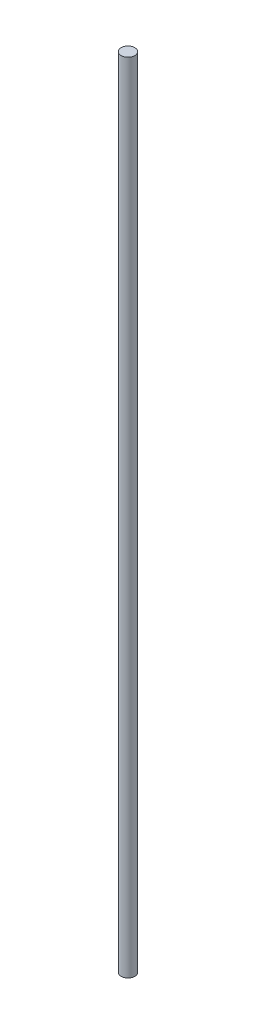
ISO-10303-21;
HEADER;
FILE_DESCRIPTION(('STEP AP214'),'2;1');
FILE_NAME('part.step','',(''),(''),'','','');
FILE_SCHEMA(('AUTOMOTIVE_DESIGN { 1 0 10303 214 1 1 1 1 }'));
ENDSEC;
DATA;
#1=APPLICATION_CONTEXT('core data for automotive mechanical design processes');
#2=APPLICATION_PROTOCOL_DEFINITION('international standard','automotive_design',2000,#1);
#3=PRODUCT_CONTEXT('',#1,'mechanical');
#4=PRODUCT('Part','Part','',(#3));
#5=PRODUCT_RELATED_PRODUCT_CATEGORY('part','',(#4));
#6=PRODUCT_DEFINITION_FORMATION('','',#4);
#7=PRODUCT_DEFINITION_CONTEXT('part definition',#1,'design');
#8=PRODUCT_DEFINITION('design','',#6,#7);
#9=PRODUCT_DEFINITION_SHAPE('','',#8);
#10=(LENGTH_UNIT() NAMED_UNIT(*) SI_UNIT(.MILLI.,.METRE.));
#11=(NAMED_UNIT(*) PLANE_ANGLE_UNIT() SI_UNIT($,.RADIAN.));
#12=(NAMED_UNIT(*) SI_UNIT($,.STERADIAN.) SOLID_ANGLE_UNIT());
#13=UNCERTAINTY_MEASURE_WITH_UNIT(LENGTH_MEASURE(1.E-05),#10,'distance_accuracy_value','');
#14=(GEOMETRIC_REPRESENTATION_CONTEXT(3) GLOBAL_UNCERTAINTY_ASSIGNED_CONTEXT((#13)) GLOBAL_UNIT_ASSIGNED_CONTEXT((#10,
#11,#12)) REPRESENTATION_CONTEXT('',''));
#15=CARTESIAN_POINT('',(0.,0.,0.));
#16=DIRECTION('',(0.,0.,1.));
#17=DIRECTION('',(1.,0.,0.));
#18=AXIS2_PLACEMENT_3D('',#15,#16,#17);
#19=CARTESIAN_POINT('',(0.,250.,0.));
#20=DIRECTION('',(0.,-1.,0.));
#21=DIRECTION('',(0.,0.,-1.));
#22=AXIS2_PLACEMENT_3D('',#19,#20,#21);
#23=CYLINDRICAL_SURFACE('',#22,2.15);
#24=CARTESIAN_POINT('',(0.,250.,0.));
#25=DIRECTION('',(0.,1.,0.));
#26=DIRECTION('',(0.,0.,1.));
#27=AXIS2_PLACEMENT_3D('',#24,#25,#26);
#28=CIRCLE('',#27,2.15);
#29=CARTESIAN_POINT('',(0.,250.,2.15));
#30=VERTEX_POINT('',#29);
#31=EDGE_CURVE('E10',#30,#30,#28,.T.);
#32=ORIENTED_EDGE('',*,*,#31,.F.);
#33=EDGE_LOOP('',(#32));
#34=FACE_BOUND('',#33,.T.);
#35=CARTESIAN_POINT('',(0.,0.,0.));
#36=DIRECTION('',(0.,1.,0.));
#37=DIRECTION('',(0.,0.,1.));
#38=AXIS2_PLACEMENT_3D('',#35,#36,#37);
#39=CIRCLE('',#38,2.15);
#40=CARTESIAN_POINT('',(0.,0.,2.15));
#41=VERTEX_POINT('',#40);
#42=EDGE_CURVE('E34',#41,#41,#39,.T.);
#43=ORIENTED_EDGE('',*,*,#42,.T.);
#44=EDGE_LOOP('',(#43));
#45=FACE_BOUND('',#44,.T.);
#46=ADVANCED_FACE('F31',(#34,#45),#23,.T.);
#47=CARTESIAN_POINT('',(0.,250.,0.));
#48=DIRECTION('',(0.,1.,0.));
#49=DIRECTION('',(0.,0.,1.));
#50=AXIS2_PLACEMENT_3D('',#47,#48,#49);
#51=PLANE('',#50);
#52=ORIENTED_EDGE('',*,*,#31,.T.);
#53=EDGE_LOOP('',(#52));
#54=FACE_BOUND('',#53,.T.);
#55=ADVANCED_FACE('F46',(#54),#51,.T.);
#56=CARTESIAN_POINT('',(0.,0.,0.));
#57=DIRECTION('',(0.,1.,0.));
#58=DIRECTION('',(0.,0.,1.));
#59=AXIS2_PLACEMENT_3D('',#56,#57,#58);
#60=PLANE('',#59);
#61=ORIENTED_EDGE('',*,*,#42,.F.);
#62=EDGE_LOOP('',(#61));
#63=FACE_BOUND('',#62,.T.);
#64=ADVANCED_FACE('F44',(#63),#60,.F.);
#65=CLOSED_SHELL('',(#46,#55,#64));
#66=MANIFOLD_SOLID_BREP('B2',#65);
#67=ADVANCED_BREP_SHAPE_REPRESENTATION('',(#18,#66),#14);
#68=SHAPE_DEFINITION_REPRESENTATION(#9,#67);
ENDSEC;
END-ISO-10303-21;
